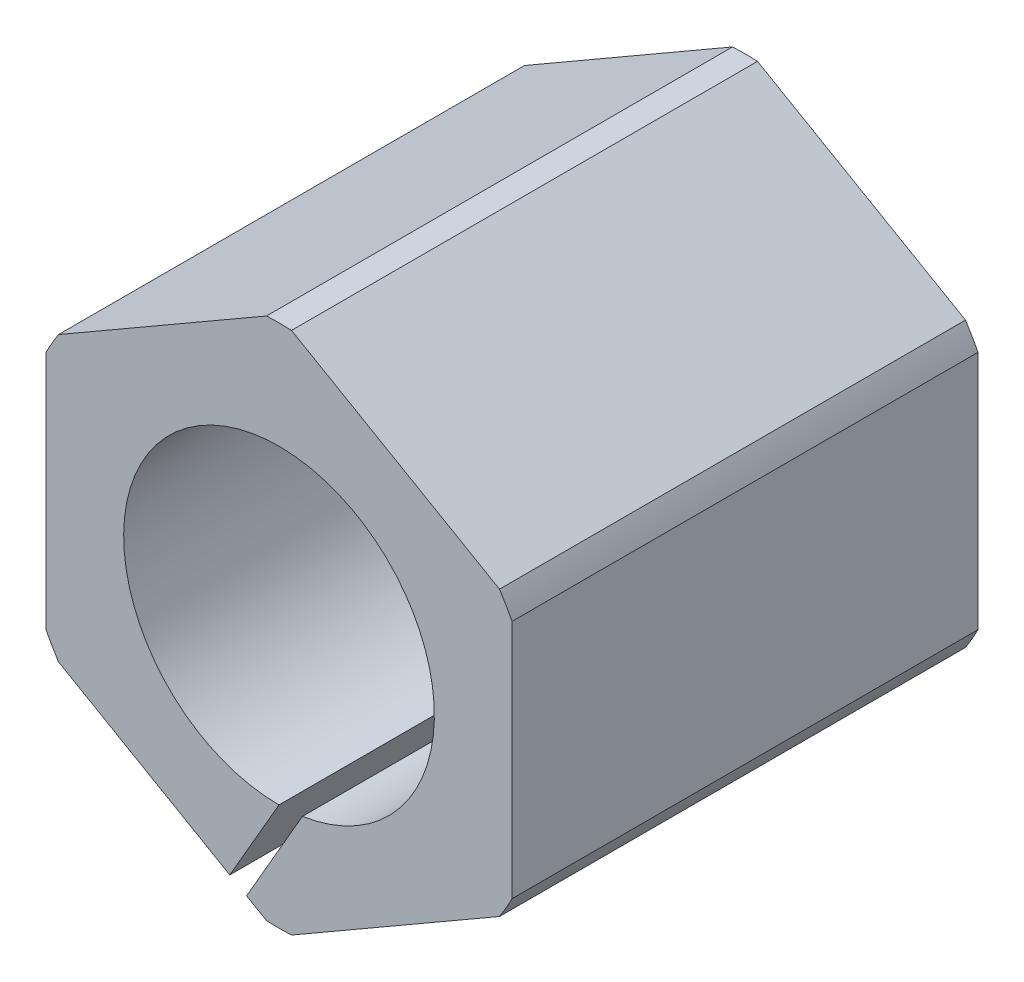
ISO-10303-21;
HEADER;
FILE_DESCRIPTION(('STEP AP214'),'2;1');
FILE_NAME('part.step','',(''),(''),'','','');
FILE_SCHEMA(('AUTOMOTIVE_DESIGN { 1 0 10303 214 1 1 1 1 }'));
ENDSEC;
DATA;
#1=APPLICATION_CONTEXT('core data for automotive mechanical design processes');
#2=APPLICATION_PROTOCOL_DEFINITION('international standard','automotive_design',2000,#1);
#3=PRODUCT_CONTEXT('',#1,'mechanical');
#4=PRODUCT('Part','Part','',(#3));
#5=PRODUCT_RELATED_PRODUCT_CATEGORY('part','',(#4));
#6=PRODUCT_DEFINITION_FORMATION('','',#4);
#7=PRODUCT_DEFINITION_CONTEXT('part definition',#1,'design');
#8=PRODUCT_DEFINITION('design','',#6,#7);
#9=PRODUCT_DEFINITION_SHAPE('','',#8);
#10=(LENGTH_UNIT() NAMED_UNIT(*) SI_UNIT(.MILLI.,.METRE.));
#11=(NAMED_UNIT(*) PLANE_ANGLE_UNIT() SI_UNIT($,.RADIAN.));
#12=(NAMED_UNIT(*) SI_UNIT($,.STERADIAN.) SOLID_ANGLE_UNIT());
#13=UNCERTAINTY_MEASURE_WITH_UNIT(LENGTH_MEASURE(1.E-05),#10,'distance_accuracy_value','');
#14=(GEOMETRIC_REPRESENTATION_CONTEXT(3) GLOBAL_UNCERTAINTY_ASSIGNED_CONTEXT((#13)) GLOBAL_UNIT_ASSIGNED_CONTEXT((#10,
#11,#12)) REPRESENTATION_CONTEXT('',''));
#15=CARTESIAN_POINT('',(0.,0.,0.));
#16=DIRECTION('',(0.,0.,1.));
#17=DIRECTION('',(1.,0.,0.));
#18=AXIS2_PLACEMENT_3D('',#15,#16,#17);
#19=CARTESIAN_POINT('',(-9.52499999999999,-5.49926131403119,9.525));
#20=DIRECTION('',(0.5,0.866025403784439,0.));
#21=DIRECTION('',(-0.866025403784439,0.5,0.));
#22=AXIS2_PLACEMENT_3D('',#19,#20,#21);
#23=PLANE('',#22);
#24=DIRECTION('',(0.866025403784439,-0.5,0.));
#25=VECTOR('',#24,1.);
#26=CARTESIAN_POINT('',(-9.52499999999999,-5.49926131403119,9.525));
#27=LINE('',#26,#25);
#28=CARTESIAN_POINT('',(-1.3254616787305,-10.2332669710468,9.525));
#29=VERTEX_POINT('',#28);
#30=CARTESIAN_POINT('',(-0.51111838863307,-10.7034282887973,9.525));
#31=VERTEX_POINT('',#30);
#32=EDGE_CURVE('E213',#29,#31,#27,.T.);
#33=ORIENTED_EDGE('',*,*,#32,.F.);
#34=DIRECTION('',(0.,0.,1.));
#35=VECTOR('',#34,1.);
#36=CARTESIAN_POINT('',(-1.3254616787305,-10.2332669710468,-9.525));
#37=LINE('',#36,#35);
#38=CARTESIAN_POINT('',(-1.3254616787305,-10.2332669710468,-9.525));
#39=VERTEX_POINT('',#38);
#40=EDGE_CURVE('E151',#39,#29,#37,.T.);
#41=ORIENTED_EDGE('',*,*,#40,.F.);
#42=DIRECTION('',(0.866025403784439,-0.5,0.));
#43=VECTOR('',#42,1.);
#44=CARTESIAN_POINT('',(-9.52499999999999,-5.49926131403119,-9.525));
#45=LINE('',#44,#43);
#46=CARTESIAN_POINT('',(-0.51111838863307,-10.7034282887973,-9.525));
#47=VERTEX_POINT('',#46);
#48=EDGE_CURVE('E169',#39,#47,#45,.T.);
#49=ORIENTED_EDGE('',*,*,#48,.T.);
#50=DIRECTION('',(0.,0.,1.));
#51=VECTOR('',#50,1.);
#52=CARTESIAN_POINT('',(-0.51111838863307,-10.7034282887973,-9.525));
#53=LINE('',#52,#51);
#54=EDGE_CURVE('E253',#31,#47,#53,.F.);
#55=ORIENTED_EDGE('',*,*,#54,.F.);
#56=EDGE_LOOP('',(#33,#41,#49,#55));
#57=FACE_BOUND('',#56,.T.);
#58=ADVANCED_FACE('F33',(#57),#23,.F.);
#59=CARTESIAN_POINT('',(0.,10.9985226280624,9.525));
#60=DIRECTION('',(0.,0.,1.));
#61=DIRECTION('',(1.,0.,0.));
#62=AXIS2_PLACEMENT_3D('',#59,#60,#61);
#63=PLANE('',#62);
#64=DIRECTION('',(0.5,0.866025403784439,0.));
#65=VECTOR('',#64,1.);
#66=CARTESIAN_POINT('',(3.43703832126949,-1.984375,9.525));
#67=LINE('',#66,#65);
#68=CARTESIAN_POINT('',(0.958554740655128,-6.27723448734931,9.525));
#69=VERTEX_POINT('',#68);
#70=EDGE_CURVE('E55',#29,#69,#67,.T.);
#71=ORIENTED_EDGE('',*,*,#70,.F.);
#72=ORIENTED_EDGE('',*,*,#32,.T.);
#73=CARTESIAN_POINT('',(0.,0.,9.525));
#74=DIRECTION('',(0.,0.,1.));
#75=DIRECTION('',(1.,0.,0.));
#76=AXIS2_PLACEMENT_3D('',#73,#74,#75);
#77=CIRCLE('',#76,10.715625);
#78=CARTESIAN_POINT('',(0.511118388633077,-10.7034282887973,9.525));
#79=VERTEX_POINT('',#78);
#80=EDGE_CURVE('E284',#31,#79,#77,.T.);
#81=ORIENTED_EDGE('',*,*,#80,.T.);
#82=DIRECTION('',(0.866025403784438,0.5,0.));
#83=VECTOR('',#82,1.);
#84=CARTESIAN_POINT('',(0.,-10.9985226280624,9.525));
#85=LINE('',#84,#83);
#86=CARTESIAN_POINT('',(9.01388161136692,-5.79435565329625,9.525));
#87=VERTEX_POINT('',#86);
#88=EDGE_CURVE('E215',#79,#87,#85,.T.);
#89=ORIENTED_EDGE('',*,*,#88,.T.);
#90=CARTESIAN_POINT('',(9.525,-4.90907263550103,9.525));
#91=VERTEX_POINT('',#90);
#92=EDGE_CURVE('E249',#87,#91,#77,.T.);
#93=ORIENTED_EDGE('',*,*,#92,.T.);
#94=DIRECTION('',(0.,1.,0.));
#95=VECTOR('',#94,1.);
#96=CARTESIAN_POINT('',(9.525,-5.49926131403118,9.525));
#97=LINE('',#96,#95);
#98=CARTESIAN_POINT('',(9.52499999999999,4.90907263550104,9.525));
#99=VERTEX_POINT('',#98);
#100=EDGE_CURVE('E184',#91,#99,#97,.T.);
#101=ORIENTED_EDGE('',*,*,#100,.T.);
#102=CARTESIAN_POINT('',(9.01388161136692,5.79435565329626,9.525));
#103=VERTEX_POINT('',#102);
#104=EDGE_CURVE('E245',#99,#103,#77,.T.);
#105=ORIENTED_EDGE('',*,*,#104,.T.);
#106=DIRECTION('',(-0.866025403784439,0.5,0.));
#107=VECTOR('',#106,1.);
#108=CARTESIAN_POINT('',(9.52499999999999,5.49926131403119,9.525));
#109=LINE('',#108,#107);
#110=CARTESIAN_POINT('',(0.511118388633078,10.7034282887973,9.525));
#111=VERTEX_POINT('',#110);
#112=EDGE_CURVE('E180',#103,#111,#109,.T.);
#113=ORIENTED_EDGE('',*,*,#112,.T.);
#114=CARTESIAN_POINT('',(-0.511118388633081,10.7034282887973,9.525));
#115=VERTEX_POINT('',#114);
#116=EDGE_CURVE('E248',#111,#115,#77,.T.);
#117=ORIENTED_EDGE('',*,*,#116,.T.);
#118=DIRECTION('',(-0.866025403784438,-0.5,0.));
#119=VECTOR('',#118,1.);
#120=CARTESIAN_POINT('',(0.,10.9985226280624,9.525));
#121=LINE('',#120,#119);
#122=CARTESIAN_POINT('',(-9.01388161136692,5.79435565329625,9.525));
#123=VERTEX_POINT('',#122);
#124=EDGE_CURVE('E207',#115,#123,#121,.T.);
#125=ORIENTED_EDGE('',*,*,#124,.T.);
#126=CARTESIAN_POINT('',(-9.525,4.90907263550103,9.525));
#127=VERTEX_POINT('',#126);
#128=EDGE_CURVE('E282',#123,#127,#77,.T.);
#129=ORIENTED_EDGE('',*,*,#128,.T.);
#130=DIRECTION('',(0.,-1.,0.));
#131=VECTOR('',#130,1.);
#132=CARTESIAN_POINT('',(-9.525,5.49926131403118,9.525));
#133=LINE('',#132,#131);
#134=CARTESIAN_POINT('',(-9.52499999999999,-4.90907263550104,9.525));
#135=VERTEX_POINT('',#134);
#136=EDGE_CURVE('E210',#127,#135,#133,.T.);
#137=ORIENTED_EDGE('',*,*,#136,.T.);
#138=CARTESIAN_POINT('',(-9.01388161136692,-5.79435565329626,9.525));
#139=VERTEX_POINT('',#138);
#140=EDGE_CURVE('E283',#135,#139,#77,.T.);
#141=ORIENTED_EDGE('',*,*,#140,.T.);
#142=CARTESIAN_POINT('',(-2.0128693429844,-9.83639197104678,9.525));
#143=VERTEX_POINT('',#142);
#144=EDGE_CURVE('E192',#139,#143,#27,.T.);
#145=ORIENTED_EDGE('',*,*,#144,.T.);
#146=DIRECTION('',(-0.5,-0.866025403784439,0.));
#147=VECTOR('',#146,1.);
#148=CARTESIAN_POINT('',(2.74963065701559,-1.5875,9.525));
#149=LINE('',#148,#147);
#150=CARTESIAN_POINT('',(0.,-6.35,9.525));
#151=VERTEX_POINT('',#150);
#152=EDGE_CURVE('E146',#151,#143,#149,.T.);
#153=ORIENTED_EDGE('',*,*,#152,.F.);
#154=CARTESIAN_POINT('',(0.,0.,9.525));
#155=DIRECTION('',(0.,0.,1.));
#156=DIRECTION('',(1.,0.,0.));
#157=AXIS2_PLACEMENT_3D('',#154,#155,#156);
#158=CIRCLE('',#157,6.35);
#159=EDGE_CURVE('E190',#69,#151,#158,.T.);
#160=ORIENTED_EDGE('',*,*,#159,.F.);
#161=EDGE_LOOP('',(#71,#72,#81,#89,#93,#101,#105,#113,#117,#125,#129,#137,#141,#145,#153,#160));
#162=FACE_BOUND('',#161,.T.);
#163=ADVANCED_FACE('F189',(#162),#63,.T.);
#164=CARTESIAN_POINT('',(0.,10.9985226280624,-9.525));
#165=DIRECTION('',(0.,0.,1.));
#166=DIRECTION('',(1.,0.,0.));
#167=AXIS2_PLACEMENT_3D('',#164,#165,#166);
#168=PLANE('',#167);
#169=ORIENTED_EDGE('',*,*,#48,.F.);
#170=DIRECTION('',(0.5,0.866025403784439,0.));
#171=VECTOR('',#170,1.);
#172=CARTESIAN_POINT('',(3.43703832126949,-1.984375,-9.525));
#173=LINE('',#172,#171);
#174=CARTESIAN_POINT('',(0.958554740655128,-6.27723448734931,-9.525));
#175=VERTEX_POINT('',#174);
#176=EDGE_CURVE('E152',#39,#175,#173,.T.);
#177=ORIENTED_EDGE('',*,*,#176,.T.);
#178=CARTESIAN_POINT('',(0.,0.,-9.525));
#179=DIRECTION('',(0.,0.,1.));
#180=DIRECTION('',(1.,0.,0.));
#181=AXIS2_PLACEMENT_3D('',#178,#179,#180);
#182=CIRCLE('',#181,6.35);
#183=CARTESIAN_POINT('',(0.,-6.35,-9.525));
#184=VERTEX_POINT('',#183);
#185=EDGE_CURVE('E163',#175,#184,#182,.T.);
#186=ORIENTED_EDGE('',*,*,#185,.T.);
#187=DIRECTION('',(-0.5,-0.866025403784439,0.));
#188=VECTOR('',#187,1.);
#189=CARTESIAN_POINT('',(2.74963065701559,-1.5875,-9.525));
#190=LINE('',#189,#188);
#191=CARTESIAN_POINT('',(-2.0128693429844,-9.83639197104678,-9.525));
#192=VERTEX_POINT('',#191);
#193=EDGE_CURVE('E48',#184,#192,#190,.T.);
#194=ORIENTED_EDGE('',*,*,#193,.T.);
#195=CARTESIAN_POINT('',(-9.01388161136692,-5.79435565329626,-9.525));
#196=VERTEX_POINT('',#195);
#197=EDGE_CURVE('E160',#196,#192,#45,.T.);
#198=ORIENTED_EDGE('',*,*,#197,.F.);
#199=CARTESIAN_POINT('',(0.,0.,-9.525));
#200=DIRECTION('',(0.,0.,1.));
#201=DIRECTION('',(1.,0.,0.));
#202=AXIS2_PLACEMENT_3D('',#199,#200,#201);
#203=CIRCLE('',#202,10.715625);
#204=CARTESIAN_POINT('',(-9.52499999999999,-4.90907263550104,-9.525));
#205=VERTEX_POINT('',#204);
#206=EDGE_CURVE('E235',#205,#196,#203,.T.);
#207=ORIENTED_EDGE('',*,*,#206,.F.);
#208=DIRECTION('',(0.,-1.,0.));
#209=VECTOR('',#208,1.);
#210=CARTESIAN_POINT('',(-9.525,5.49926131403118,-9.525));
#211=LINE('',#210,#209);
#212=CARTESIAN_POINT('',(-9.525,4.90907263550103,-9.525));
#213=VERTEX_POINT('',#212);
#214=EDGE_CURVE('E174',#213,#205,#211,.T.);
#215=ORIENTED_EDGE('',*,*,#214,.F.);
#216=CARTESIAN_POINT('',(-9.01388161136692,5.79435565329625,-9.525));
#217=VERTEX_POINT('',#216);
#218=EDGE_CURVE('E234',#217,#213,#203,.T.);
#219=ORIENTED_EDGE('',*,*,#218,.F.);
#220=DIRECTION('',(-0.866025403784438,-0.5,0.));
#221=VECTOR('',#220,1.);
#222=CARTESIAN_POINT('',(0.,10.9985226280624,-9.525));
#223=LINE('',#222,#221);
#224=CARTESIAN_POINT('',(-0.511118388633081,10.7034282887973,-9.525));
#225=VERTEX_POINT('',#224);
#226=EDGE_CURVE('E198',#225,#217,#223,.T.);
#227=ORIENTED_EDGE('',*,*,#226,.F.);
#228=CARTESIAN_POINT('',(0.511118388633078,10.7034282887973,-9.525));
#229=VERTEX_POINT('',#228);
#230=EDGE_CURVE('E239',#229,#225,#203,.T.);
#231=ORIENTED_EDGE('',*,*,#230,.F.);
#232=DIRECTION('',(-0.866025403784439,0.5,0.));
#233=VECTOR('',#232,1.);
#234=CARTESIAN_POINT('',(9.52499999999999,5.49926131403119,-9.525));
#235=LINE('',#234,#233);
#236=CARTESIAN_POINT('',(9.01388161136692,5.79435565329626,-9.525));
#237=VERTEX_POINT('',#236);
#238=EDGE_CURVE('E195',#237,#229,#235,.T.);
#239=ORIENTED_EDGE('',*,*,#238,.F.);
#240=CARTESIAN_POINT('',(9.52499999999999,4.90907263550104,-9.525));
#241=VERTEX_POINT('',#240);
#242=EDGE_CURVE('E241',#241,#237,#203,.T.);
#243=ORIENTED_EDGE('',*,*,#242,.F.);
#244=DIRECTION('',(0.,1.,0.));
#245=VECTOR('',#244,1.);
#246=CARTESIAN_POINT('',(9.525,-5.49926131403118,-9.525));
#247=LINE('',#246,#245);
#248=CARTESIAN_POINT('',(9.525,-4.90907263550103,-9.525));
#249=VERTEX_POINT('',#248);
#250=EDGE_CURVE('E172',#249,#241,#247,.T.);
#251=ORIENTED_EDGE('',*,*,#250,.F.);
#252=CARTESIAN_POINT('',(9.01388161136692,-5.79435565329625,-9.525));
#253=VERTEX_POINT('',#252);
#254=EDGE_CURVE('E240',#253,#249,#203,.T.);
#255=ORIENTED_EDGE('',*,*,#254,.F.);
#256=DIRECTION('',(0.866025403784438,0.5,0.));
#257=VECTOR('',#256,1.);
#258=CARTESIAN_POINT('',(0.,-10.9985226280624,-9.525));
#259=LINE('',#258,#257);
#260=CARTESIAN_POINT('',(0.511118388633077,-10.7034282887973,-9.525));
#261=VERTEX_POINT('',#260);
#262=EDGE_CURVE('E168',#261,#253,#259,.T.);
#263=ORIENTED_EDGE('',*,*,#262,.F.);
#264=EDGE_CURVE('E237',#47,#261,#203,.T.);
#265=ORIENTED_EDGE('',*,*,#264,.F.);
#266=EDGE_LOOP('',(#169,#177,#186,#194,#198,#207,#215,#219,#227,#231,#239,#243,#251,#255,#263,#265));
#267=FACE_BOUND('',#266,.T.);
#268=ADVANCED_FACE('F158',(#267),#168,.F.);
#269=CARTESIAN_POINT('',(9.52499999999999,5.49926131403119,9.525));
#270=DIRECTION('',(-0.5,-0.866025403784439,0.));
#271=DIRECTION('',(0.866025403784439,-0.5,0.));
#272=AXIS2_PLACEMENT_3D('',#269,#270,#271);
#273=PLANE('',#272);
#274=DIRECTION('',(0.,0.,1.));
#275=VECTOR('',#274,1.);
#276=CARTESIAN_POINT('',(9.01388161136692,5.79435565329626,-9.525));
#277=LINE('',#276,#275);
#278=EDGE_CURVE('E200',#237,#103,#277,.T.);
#279=ORIENTED_EDGE('',*,*,#278,.F.);
#280=ORIENTED_EDGE('',*,*,#238,.T.);
#281=DIRECTION('',(0.,0.,1.));
#282=VECTOR('',#281,1.);
#283=CARTESIAN_POINT('',(0.511118388633078,10.7034282887973,-9.525));
#284=LINE('',#283,#282);
#285=EDGE_CURVE('E262',#111,#229,#284,.F.);
#286=ORIENTED_EDGE('',*,*,#285,.F.);
#287=ORIENTED_EDGE('',*,*,#112,.F.);
#288=EDGE_LOOP('',(#279,#280,#286,#287));
#289=FACE_BOUND('',#288,.T.);
#290=ADVANCED_FACE('F35',(#289),#273,.F.);
#291=CARTESIAN_POINT('',(0.,10.9985226280624,9.525));
#292=DIRECTION('',(0.5,-0.866025403784438,0.));
#293=DIRECTION('',(0.866025403784438,0.5,0.));
#294=AXIS2_PLACEMENT_3D('',#291,#292,#293);
#295=PLANE('',#294);
#296=DIRECTION('',(0.,0.,1.));
#297=VECTOR('',#296,1.);
#298=CARTESIAN_POINT('',(-0.511118388633081,10.7034282887973,-9.525));
#299=LINE('',#298,#297);
#300=EDGE_CURVE('E261',#225,#115,#299,.T.);
#301=ORIENTED_EDGE('',*,*,#300,.F.);
#302=ORIENTED_EDGE('',*,*,#226,.T.);
#303=DIRECTION('',(0.,0.,1.));
#304=VECTOR('',#303,1.);
#305=CARTESIAN_POINT('',(-9.01388161136692,5.79435565329625,-9.525));
#306=LINE('',#305,#304);
#307=EDGE_CURVE('E259',#123,#217,#306,.F.);
#308=ORIENTED_EDGE('',*,*,#307,.F.);
#309=ORIENTED_EDGE('',*,*,#124,.F.);
#310=EDGE_LOOP('',(#301,#302,#308,#309));
#311=FACE_BOUND('',#310,.T.);
#312=ADVANCED_FACE('F280',(#311),#295,.F.);
#313=CARTESIAN_POINT('',(-9.525,5.49926131403118,9.525));
#314=DIRECTION('',(1.,0.,0.));
#315=DIRECTION('',(0.,1.,0.));
#316=AXIS2_PLACEMENT_3D('',#313,#314,#315);
#317=PLANE('',#316);
#318=DIRECTION('',(0.,0.,1.));
#319=VECTOR('',#318,1.);
#320=CARTESIAN_POINT('',(-9.525,4.90907263550103,-9.525));
#321=LINE('',#320,#319);
#322=EDGE_CURVE('E232',#213,#127,#321,.T.);
#323=ORIENTED_EDGE('',*,*,#322,.F.);
#324=ORIENTED_EDGE('',*,*,#214,.T.);
#325=DIRECTION('',(0.,0.,1.));
#326=VECTOR('',#325,1.);
#327=CARTESIAN_POINT('',(-9.52499999999999,-4.90907263550104,-9.525));
#328=LINE('',#327,#326);
#329=EDGE_CURVE('E231',#135,#205,#328,.F.);
#330=ORIENTED_EDGE('',*,*,#329,.F.);
#331=ORIENTED_EDGE('',*,*,#136,.F.);
#332=EDGE_LOOP('',(#323,#324,#330,#331));
#333=FACE_BOUND('',#332,.T.);
#334=ADVANCED_FACE('F229',(#333),#317,.F.);
#335=ORIENTED_EDGE('',*,*,#197,.T.);
#336=DIRECTION('',(0.,0.,1.));
#337=VECTOR('',#336,1.);
#338=CARTESIAN_POINT('',(-2.0128693429844,-9.83639197104678,-9.525));
#339=LINE('',#338,#337);
#340=EDGE_CURVE('E143',#192,#143,#339,.T.);
#341=ORIENTED_EDGE('',*,*,#340,.T.);
#342=ORIENTED_EDGE('',*,*,#144,.F.);
#343=DIRECTION('',(0.,0.,1.));
#344=VECTOR('',#343,1.);
#345=CARTESIAN_POINT('',(-9.01388161136692,-5.79435565329626,-9.525));
#346=LINE('',#345,#344);
#347=EDGE_CURVE('E167',#196,#139,#346,.T.);
#348=ORIENTED_EDGE('',*,*,#347,.F.);
#349=EDGE_LOOP('',(#335,#341,#342,#348));
#350=FACE_BOUND('',#349,.T.);
#351=ADVANCED_FACE('F166',(#350),#23,.F.);
#352=CARTESIAN_POINT('',(0.,-10.9985226280624,9.525));
#353=DIRECTION('',(-0.500000000000001,0.866025403784438,0.));
#354=DIRECTION('',(-0.866025403784438,-0.500000000000001,0.));
#355=AXIS2_PLACEMENT_3D('',#352,#353,#354);
#356=PLANE('',#355);
#357=DIRECTION('',(0.,0.,1.));
#358=VECTOR('',#357,1.);
#359=CARTESIAN_POINT('',(0.511118388633078,-10.7034282887973,-9.525));
#360=LINE('',#359,#358);
#361=EDGE_CURVE('E251',#261,#79,#360,.T.);
#362=ORIENTED_EDGE('',*,*,#361,.F.);
#363=ORIENTED_EDGE('',*,*,#262,.T.);
#364=DIRECTION('',(0.,0.,1.));
#365=VECTOR('',#364,1.);
#366=CARTESIAN_POINT('',(9.01388161136693,-5.79435565329625,-9.525));
#367=LINE('',#366,#365);
#368=EDGE_CURVE('E243',#87,#253,#367,.F.);
#369=ORIENTED_EDGE('',*,*,#368,.F.);
#370=ORIENTED_EDGE('',*,*,#88,.F.);
#371=EDGE_LOOP('',(#362,#363,#369,#370));
#372=FACE_BOUND('',#371,.T.);
#373=ADVANCED_FACE('F301',(#372),#356,.F.);
#374=CARTESIAN_POINT('',(9.525,-5.49926131403118,9.525));
#375=DIRECTION('',(-1.,0.,0.));
#376=DIRECTION('',(0.,-1.,0.));
#377=AXIS2_PLACEMENT_3D('',#374,#375,#376);
#378=PLANE('',#377);
#379=DIRECTION('',(0.,0.,1.));
#380=VECTOR('',#379,1.);
#381=CARTESIAN_POINT('',(9.525,-4.90907263550103,-9.525));
#382=LINE('',#381,#380);
#383=EDGE_CURVE('E183',#249,#91,#382,.T.);
#384=ORIENTED_EDGE('',*,*,#383,.F.);
#385=ORIENTED_EDGE('',*,*,#250,.T.);
#386=DIRECTION('',(0.,0.,1.));
#387=VECTOR('',#386,1.);
#388=CARTESIAN_POINT('',(9.52499999999999,4.90907263550104,-9.525));
#389=LINE('',#388,#387);
#390=EDGE_CURVE('E181',#99,#241,#389,.F.);
#391=ORIENTED_EDGE('',*,*,#390,.F.);
#392=ORIENTED_EDGE('',*,*,#100,.F.);
#393=EDGE_LOOP('',(#384,#385,#391,#392));
#394=FACE_BOUND('',#393,.T.);
#395=ADVANCED_FACE('F308',(#394),#378,.F.);
#396=CARTESIAN_POINT('',(0.,0.,9.525));
#397=DIRECTION('',(0.,0.,-1.));
#398=DIRECTION('',(-1.,0.,0.));
#399=AXIS2_PLACEMENT_3D('',#396,#397,#398);
#400=CYLINDRICAL_SURFACE('',#399,6.35);
#401=DIRECTION('',(0.,0.,-1.));
#402=VECTOR('',#401,1.);
#403=CARTESIAN_POINT('',(0.958554740655128,-6.27723448734931,9.525));
#404=LINE('',#403,#402);
#405=EDGE_CURVE('E12',#69,#175,#404,.T.);
#406=ORIENTED_EDGE('',*,*,#405,.F.);
#407=ORIENTED_EDGE('',*,*,#159,.T.);
#408=DIRECTION('',(0.,0.,-1.));
#409=VECTOR('',#408,1.);
#410=CARTESIAN_POINT('',(0.,-6.35,9.525));
#411=LINE('',#410,#409);
#412=EDGE_CURVE('E41',#184,#151,#411,.F.);
#413=ORIENTED_EDGE('',*,*,#412,.F.);
#414=ORIENTED_EDGE('',*,*,#185,.F.);
#415=EDGE_LOOP('',(#406,#407,#413,#414));
#416=FACE_BOUND('',#415,.T.);
#417=ADVANCED_FACE('F194',(#416),#400,.F.);
#418=CARTESIAN_POINT('',(0.,0.,-9.525));
#419=DIRECTION('',(0.,0.,1.));
#420=DIRECTION('',(1.,0.,0.));
#421=AXIS2_PLACEMENT_3D('',#418,#419,#420);
#422=CYLINDRICAL_SURFACE('',#421,10.715625);
#423=ORIENTED_EDGE('',*,*,#278,.T.);
#424=ORIENTED_EDGE('',*,*,#104,.F.);
#425=ORIENTED_EDGE('',*,*,#390,.T.);
#426=ORIENTED_EDGE('',*,*,#242,.T.);
#427=EDGE_LOOP('',(#423,#424,#425,#426));
#428=FACE_BOUND('',#427,.T.);
#429=ADVANCED_FACE('F268',(#428),#422,.T.);
#430=ORIENTED_EDGE('',*,*,#368,.T.);
#431=ORIENTED_EDGE('',*,*,#254,.T.);
#432=ORIENTED_EDGE('',*,*,#383,.T.);
#433=ORIENTED_EDGE('',*,*,#92,.F.);
#434=EDGE_LOOP('',(#430,#431,#432,#433));
#435=FACE_BOUND('',#434,.T.);
#436=ADVANCED_FACE('F306',(#435),#422,.T.);
#437=ORIENTED_EDGE('',*,*,#54,.T.);
#438=ORIENTED_EDGE('',*,*,#264,.T.);
#439=ORIENTED_EDGE('',*,*,#361,.T.);
#440=ORIENTED_EDGE('',*,*,#80,.F.);
#441=EDGE_LOOP('',(#437,#438,#439,#440));
#442=FACE_BOUND('',#441,.T.);
#443=ADVANCED_FACE('F297',(#442),#422,.T.);
#444=ORIENTED_EDGE('',*,*,#329,.T.);
#445=ORIENTED_EDGE('',*,*,#206,.T.);
#446=ORIENTED_EDGE('',*,*,#347,.T.);
#447=ORIENTED_EDGE('',*,*,#140,.F.);
#448=EDGE_LOOP('',(#444,#445,#446,#447));
#449=FACE_BOUND('',#448,.T.);
#450=ADVANCED_FACE('F365',(#449),#422,.T.);
#451=ORIENTED_EDGE('',*,*,#307,.T.);
#452=ORIENTED_EDGE('',*,*,#218,.T.);
#453=ORIENTED_EDGE('',*,*,#322,.T.);
#454=ORIENTED_EDGE('',*,*,#128,.F.);
#455=EDGE_LOOP('',(#451,#452,#453,#454));
#456=FACE_BOUND('',#455,.T.);
#457=ADVANCED_FACE('F359',(#456),#422,.T.);
#458=ORIENTED_EDGE('',*,*,#285,.T.);
#459=ORIENTED_EDGE('',*,*,#230,.T.);
#460=ORIENTED_EDGE('',*,*,#300,.T.);
#461=ORIENTED_EDGE('',*,*,#116,.F.);
#462=EDGE_LOOP('',(#458,#459,#460,#461));
#463=FACE_BOUND('',#462,.T.);
#464=ADVANCED_FACE('F278',(#463),#422,.T.);
#465=CARTESIAN_POINT('',(2.74963065701559,-1.5875,-9.525));
#466=DIRECTION('',(-0.866025403784439,0.5,0.));
#467=DIRECTION('',(-0.5,-0.866025403784439,0.));
#468=AXIS2_PLACEMENT_3D('',#465,#466,#467);
#469=PLANE('',#468);
#470=ORIENTED_EDGE('',*,*,#412,.T.);
#471=ORIENTED_EDGE('',*,*,#152,.T.);
#472=ORIENTED_EDGE('',*,*,#340,.F.);
#473=ORIENTED_EDGE('',*,*,#193,.F.);
#474=EDGE_LOOP('',(#470,#471,#472,#473));
#475=FACE_BOUND('',#474,.T.);
#476=ADVANCED_FACE('F144',(#475),#469,.F.);
#477=CARTESIAN_POINT('',(3.43703832126949,-1.984375,-9.525));
#478=DIRECTION('',(0.866025403784439,-0.5,0.));
#479=DIRECTION('',(0.5,0.866025403784439,0.));
#480=AXIS2_PLACEMENT_3D('',#477,#478,#479);
#481=PLANE('',#480);
#482=ORIENTED_EDGE('',*,*,#405,.T.);
#483=ORIENTED_EDGE('',*,*,#176,.F.);
#484=ORIENTED_EDGE('',*,*,#40,.T.);
#485=ORIENTED_EDGE('',*,*,#70,.T.);
#486=EDGE_LOOP('',(#482,#483,#484,#485));
#487=FACE_BOUND('',#486,.T.);
#488=ADVANCED_FACE('F292',(#487),#481,.F.);
#489=CLOSED_SHELL('',(#58,#163,#268,#290,#312,#334,#351,#373,#395,#417,#429,#436,#443,#450,#457,
#464,#476,#488));
#490=MANIFOLD_SOLID_BREP('B2',#489);
#491=ADVANCED_BREP_SHAPE_REPRESENTATION('',(#18,#490),#14);
#492=SHAPE_DEFINITION_REPRESENTATION(#9,#491);
ENDSEC;
END-ISO-10303-21;
